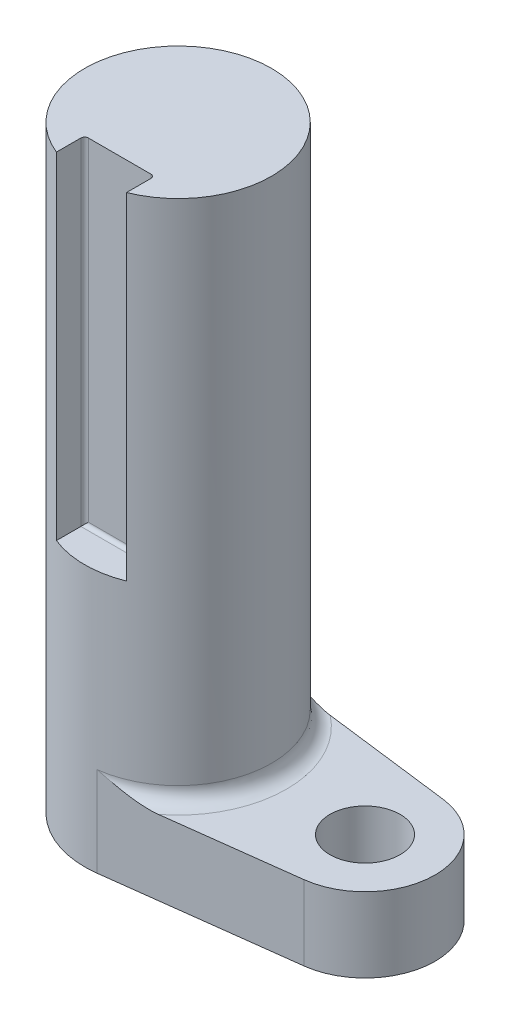
ISO-10303-21;
HEADER;
FILE_DESCRIPTION(('STEP AP214'),'2;1');
FILE_NAME('part.step','',(''),(''),'','','');
FILE_SCHEMA(('AUTOMOTIVE_DESIGN { 1 0 10303 214 1 1 1 1 }'));
ENDSEC;
DATA;
#1=APPLICATION_CONTEXT('core data for automotive mechanical design processes');
#2=APPLICATION_PROTOCOL_DEFINITION('international standard','automotive_design',2000,#1);
#3=PRODUCT_CONTEXT('',#1,'mechanical');
#4=PRODUCT('Part','Part','',(#3));
#5=PRODUCT_RELATED_PRODUCT_CATEGORY('part','',(#4));
#6=PRODUCT_DEFINITION_FORMATION('','',#4);
#7=PRODUCT_DEFINITION_CONTEXT('part definition',#1,'design');
#8=PRODUCT_DEFINITION('design','',#6,#7);
#9=PRODUCT_DEFINITION_SHAPE('','',#8);
#10=(LENGTH_UNIT() NAMED_UNIT(*) SI_UNIT(.MILLI.,.METRE.));
#11=(NAMED_UNIT(*) PLANE_ANGLE_UNIT() SI_UNIT($,.RADIAN.));
#12=(NAMED_UNIT(*) SI_UNIT($,.STERADIAN.) SOLID_ANGLE_UNIT());
#13=UNCERTAINTY_MEASURE_WITH_UNIT(LENGTH_MEASURE(1.E-05),#10,'distance_accuracy_value','');
#14=(GEOMETRIC_REPRESENTATION_CONTEXT(3) GLOBAL_UNCERTAINTY_ASSIGNED_CONTEXT((#13)) GLOBAL_UNIT_ASSIGNED_CONTEXT((#10,
#11,#12)) REPRESENTATION_CONTEXT('',''));
#15=CARTESIAN_POINT('',(0.,0.,0.));
#16=DIRECTION('',(0.,0.,1.));
#17=DIRECTION('',(1.,0.,0.));
#18=AXIS2_PLACEMENT_3D('',#15,#16,#17);
#19=CARTESIAN_POINT('',(0.,17.78,0.));
#20=DIRECTION('',(0.,-1.,0.));
#21=DIRECTION('',(0.,0.,-1.));
#22=AXIS2_PLACEMENT_3D('',#19,#20,#21);
#23=CYLINDRICAL_SURFACE('',#22,3.175);
#24=CARTESIAN_POINT('',(0.,0.508000000000002,0.));
#25=DIRECTION('',(0.,-1.,0.));
#26=DIRECTION('',(0.,0.,-1.));
#27=AXIS2_PLACEMENT_3D('',#24,#25,#26);
#28=CIRCLE('',#27,3.175);
#29=CARTESIAN_POINT('',(0.396875,0.508000000000002,3.15009765473628));
#30=VERTEX_POINT('',#29);
#31=CARTESIAN_POINT('',(0.396875,0.508000000000002,-3.15009765473628));
#32=VERTEX_POINT('',#31);
#33=EDGE_CURVE('E210',#30,#32,#28,.F.);
#34=ORIENTED_EDGE('',*,*,#33,.T.);
#35=DIRECTION('',(0.,1.,0.));
#36=VECTOR('',#35,1.);
#37=CARTESIAN_POINT('',(0.396875,-2.54,-3.15009765473628));
#38=LINE('',#37,#36);
#39=CARTESIAN_POINT('',(0.396875,-2.54,-3.15009765473628));
#40=VERTEX_POINT('',#39);
#41=EDGE_CURVE('E190',#40,#32,#38,.T.);
#42=ORIENTED_EDGE('',*,*,#41,.F.);
#43=CARTESIAN_POINT('',(0.,-2.54,0.));
#44=DIRECTION('',(0.,-1.,0.));
#45=DIRECTION('',(0.,0.,-1.));
#46=AXIS2_PLACEMENT_3D('',#43,#44,#45);
#47=CIRCLE('',#46,3.175);
#48=CARTESIAN_POINT('',(0.396875,-2.54,3.15009765473628));
#49=VERTEX_POINT('',#48);
#50=EDGE_CURVE('E188',#49,#40,#47,.T.);
#51=ORIENTED_EDGE('',*,*,#50,.F.);
#52=DIRECTION('',(0.,1.,0.));
#53=VECTOR('',#52,1.);
#54=CARTESIAN_POINT('',(0.396875,-2.54,3.15009765473628));
#55=LINE('',#54,#53);
#56=EDGE_CURVE('E201',#49,#30,#55,.T.);
#57=ORIENTED_EDGE('',*,*,#56,.T.);
#58=EDGE_LOOP('',(#34,#42,#51,#57));
#59=FACE_BOUND('',#58,.T.);
#60=DIRECTION('',(0.,-1.,0.));
#61=VECTOR('',#60,1.);
#62=CARTESIAN_POINT('',(1.190625,17.78,2.94330377456609));
#63=LINE('',#62,#61);
#64=CARTESIAN_POINT('',(1.190625,6.35,2.94330377456609));
#65=VERTEX_POINT('',#64);
#66=CARTESIAN_POINT('',(1.190625,17.78,2.94330377456609));
#67=VERTEX_POINT('',#66);
#68=EDGE_CURVE('E142',#65,#67,#63,.F.);
#69=ORIENTED_EDGE('',*,*,#68,.F.);
#70=CARTESIAN_POINT('',(0.,6.35,0.));
#71=DIRECTION('',(0.,-1.,0.));
#72=DIRECTION('',(0.,0.,-1.));
#73=AXIS2_PLACEMENT_3D('',#70,#71,#72);
#74=CIRCLE('',#73,3.175);
#75=CARTESIAN_POINT('',(-1.190625,6.35,2.94330377456609));
#76=VERTEX_POINT('',#75);
#77=EDGE_CURVE('E127',#65,#76,#74,.T.);
#78=ORIENTED_EDGE('',*,*,#77,.T.);
#79=DIRECTION('',(0.,-1.,0.));
#80=VECTOR('',#79,1.);
#81=CARTESIAN_POINT('',(-1.190625,17.78,2.94330377456609));
#82=LINE('',#81,#80);
#83=CARTESIAN_POINT('',(-1.190625,17.78,2.94330377456609));
#84=VERTEX_POINT('',#83);
#85=EDGE_CURVE('E132',#84,#76,#82,.T.);
#86=ORIENTED_EDGE('',*,*,#85,.F.);
#87=CARTESIAN_POINT('',(0.,17.78,0.));
#88=DIRECTION('',(0.,1.,0.));
#89=DIRECTION('',(0.,0.,1.));
#90=AXIS2_PLACEMENT_3D('',#87,#88,#89);
#91=CIRCLE('',#90,3.175);
#92=EDGE_CURVE('E208',#67,#84,#91,.T.);
#93=ORIENTED_EDGE('',*,*,#92,.F.);
#94=EDGE_LOOP('',(#69,#78,#86,#93));
#95=FACE_BOUND('',#94,.T.);
#96=ADVANCED_FACE('F39',(#59,#95),#23,.T.);
#97=CARTESIAN_POINT('',(0.,17.78,0.));
#98=DIRECTION('',(0.,1.,0.));
#99=DIRECTION('',(0.,0.,1.));
#100=AXIS2_PLACEMENT_3D('',#97,#98,#99);
#101=PLANE('',#100);
#102=DIRECTION('',(0.,0.,-1.));
#103=VECTOR('',#102,1.);
#104=CARTESIAN_POINT('',(-1.190625,17.78,0.));
#105=LINE('',#104,#103);
#106=CARTESIAN_POINT('',(-1.190625,17.78,2.11328));
#107=VERTEX_POINT('',#106);
#108=EDGE_CURVE('E138',#84,#107,#105,.T.);
#109=ORIENTED_EDGE('',*,*,#108,.T.);
#110=CARTESIAN_POINT('',(-1.063625,17.78,2.11328));
#111=DIRECTION('',(0.,1.,0.));
#112=DIRECTION('',(0.,0.,1.));
#113=AXIS2_PLACEMENT_3D('',#110,#111,#112);
#114=CIRCLE('',#113,0.127);
#115=CARTESIAN_POINT('',(-1.063625,17.78,1.98628));
#116=VERTEX_POINT('',#115);
#117=EDGE_CURVE('E48',#107,#116,#114,.F.);
#118=ORIENTED_EDGE('',*,*,#117,.T.);
#119=DIRECTION('',(1.,0.,0.));
#120=VECTOR('',#119,1.);
#121=CARTESIAN_POINT('',(0.,17.78,1.98628));
#122=LINE('',#121,#120);
#123=CARTESIAN_POINT('',(1.063625,17.78,1.98628));
#124=VERTEX_POINT('',#123);
#125=EDGE_CURVE('E151',#116,#124,#122,.T.);
#126=ORIENTED_EDGE('',*,*,#125,.T.);
#127=CARTESIAN_POINT('',(1.063625,17.78,2.11328));
#128=DIRECTION('',(0.,1.,0.));
#129=DIRECTION('',(0.,0.,1.));
#130=AXIS2_PLACEMENT_3D('',#127,#128,#129);
#131=CIRCLE('',#130,0.127);
#132=CARTESIAN_POINT('',(1.190625,17.78,2.11328));
#133=VERTEX_POINT('',#132);
#134=EDGE_CURVE('E11',#124,#133,#131,.F.);
#135=ORIENTED_EDGE('',*,*,#134,.T.);
#136=DIRECTION('',(0.,0.,1.));
#137=VECTOR('',#136,1.);
#138=CARTESIAN_POINT('',(1.190625,17.78,0.));
#139=LINE('',#138,#137);
#140=EDGE_CURVE('E147',#133,#67,#139,.T.);
#141=ORIENTED_EDGE('',*,*,#140,.T.);
#142=ORIENTED_EDGE('',*,*,#92,.T.);
#143=EDGE_LOOP('',(#109,#118,#126,#135,#141,#142));
#144=FACE_BOUND('',#143,.T.);
#145=ADVANCED_FACE('F251',(#144),#101,.T.);
#146=CARTESIAN_POINT('',(0.396875,-2.54,-3.15009765473628));
#147=DIRECTION('',(0.125,0.,-0.992156741649221));
#148=DIRECTION('',(-0.992156741649222,0.,-0.125));
#149=AXIS2_PLACEMENT_3D('',#146,#147,#148);
#150=PLANE('',#149);
#151=DIRECTION('',(-0.992156741649222,0.,-0.125));
#152=VECTOR('',#151,1.);
#153=CARTESIAN_POINT('',(0.396875,0.,-3.15009765473628));
#154=LINE('',#153,#152);
#155=CARTESIAN_POINT('',(6.64765625,0.,-2.36257324105221));
#156=VERTEX_POINT('',#155);
#157=CARTESIAN_POINT('',(2.24874665457004,0.,-2.91678375673618));
#158=VERTEX_POINT('',#157);
#159=EDGE_CURVE('E193',#156,#158,#154,.T.);
#160=ORIENTED_EDGE('',*,*,#159,.F.);
#161=DIRECTION('',(0.,1.,0.));
#162=VECTOR('',#161,1.);
#163=CARTESIAN_POINT('',(6.64765625,-2.54,-2.36257324105221));
#164=LINE('',#163,#162);
#165=CARTESIAN_POINT('',(6.64765625,-2.54,-2.36257324105221));
#166=VERTEX_POINT('',#165);
#167=EDGE_CURVE('E206',#166,#156,#164,.T.);
#168=ORIENTED_EDGE('',*,*,#167,.F.);
#169=DIRECTION('',(-0.992156741649222,0.,-0.125));
#170=VECTOR('',#169,1.);
#171=CARTESIAN_POINT('',(0.396875,-2.54,-3.15009765473628));
#172=LINE('',#171,#170);
#173=EDGE_CURVE('E178',#166,#40,#172,.T.);
#174=ORIENTED_EDGE('',*,*,#173,.T.);
#175=ORIENTED_EDGE('',*,*,#41,.T.);
#176=CARTESIAN_POINT('',(2.24874665457004,0.,-2.91678375673618));
#177=CARTESIAN_POINT('',(2.21231549692085,5.71728721592752E-06,-2.92137365117018));
#178=CARTESIAN_POINT('',(2.1758992098971,0.00102172884681024,-2.92596167208147));
#179=CARTESIAN_POINT('',(2.1031796100752,0.00485117368516612,-2.93512348048952));
#180=CARTESIAN_POINT('',(2.0668762431913,0.00766354336836887,-2.93969727480043));
#181=CARTESIAN_POINT('',(1.95839957562028,0.0184425634130274,-2.95336405029785));
#182=CARTESIAN_POINT('',(1.88645399557375,0.0287536847308181,-2.9624283413804));
#183=CARTESIAN_POINT('',(1.74411958427555,0.0541431163065831,-2.98036079163286));
#184=CARTESIAN_POINT('',(1.67372251439236,0.0691765666242501,-2.9892299887728));
#185=CARTESIAN_POINT('',(1.53378182393322,0.103023101549795,-3.00686085854677));
#186=CARTESIAN_POINT('',(1.46423892542614,0.121839177901396,-3.01562244020869));
#187=CARTESIAN_POINT('',(1.22704733837716,0.191369163494823,-3.04550577127576));
#188=CARTESIAN_POINT('',(1.06148442447234,0.249183267367272,-3.06636473777706));
#189=CARTESIAN_POINT('',(0.73302229538363,0.372566088486213,-3.10774707628523));
#190=CARTESIAN_POINT('',(0.570129927965523,0.438151996715627,-3.12826958555471));
#191=CARTESIAN_POINT('',(0.403795894832264,0.505209760541777,-3.14922570394694));
#192=CARTESIAN_POINT('',(0.400335450392073,0.506604880917865,-3.14966167896667));
#193=CARTESIAN_POINT('',(0.396875,0.508000000000002,-3.15009765473628));
#194=B_SPLINE_CURVE_WITH_KNOTS('',3,(#176,#177,#178,#179,#180,#181,#182,#183,#184,#185,#186,
#187,#188,#189,#190,#191,#192,#193),.UNSPECIFIED.,.F.,.F.,(4,2,2,2,2,2,2,2,4),(0.,
0.110120572144947,0.22017600398342,0.439667149666635,0.657133261980571,0.874772053488899,
1.40399836213705,1.93441795718018,1.94568738488306),.UNSPECIFIED.);
#195=EDGE_CURVE('E215',#32,#158,#194,.F.);
#196=ORIENTED_EDGE('',*,*,#195,.T.);
#197=EDGE_LOOP('',(#160,#168,#174,#175,#196));
#198=FACE_BOUND('',#197,.T.);
#199=ADVANCED_FACE('F228',(#198),#150,.T.);
#200=CARTESIAN_POINT('',(6.35,-2.54,0.));
#201=DIRECTION('',(0.,1.,0.));
#202=DIRECTION('',(0.,0.,1.));
#203=AXIS2_PLACEMENT_3D('',#200,#201,#202);
#204=CYLINDRICAL_SURFACE('',#203,2.38125);
#205=CARTESIAN_POINT('',(6.35,0.,0.));
#206=DIRECTION('',(0.,-1.,0.));
#207=DIRECTION('',(0.,0.,-1.));
#208=AXIS2_PLACEMENT_3D('',#205,#206,#207);
#209=CIRCLE('',#208,2.38125);
#210=CARTESIAN_POINT('',(6.64765625,0.,2.36257324105221));
#211=VERTEX_POINT('',#210);
#212=EDGE_CURVE('E196',#211,#156,#209,.F.);
#213=ORIENTED_EDGE('',*,*,#212,.F.);
#214=DIRECTION('',(0.,1.,0.));
#215=VECTOR('',#214,1.);
#216=CARTESIAN_POINT('',(6.64765625,-2.54,2.36257324105221));
#217=LINE('',#216,#215);
#218=CARTESIAN_POINT('',(6.64765625,-2.54,2.36257324105221));
#219=VERTEX_POINT('',#218);
#220=EDGE_CURVE('E203',#219,#211,#217,.T.);
#221=ORIENTED_EDGE('',*,*,#220,.F.);
#222=CARTESIAN_POINT('',(6.35,-2.54,0.));
#223=DIRECTION('',(0.,-1.,0.));
#224=DIRECTION('',(0.,0.,-1.));
#225=AXIS2_PLACEMENT_3D('',#222,#223,#224);
#226=CIRCLE('',#225,2.38125);
#227=EDGE_CURVE('E182',#219,#166,#226,.F.);
#228=ORIENTED_EDGE('',*,*,#227,.T.);
#229=ORIENTED_EDGE('',*,*,#167,.T.);
#230=EDGE_LOOP('',(#213,#221,#228,#229));
#231=FACE_BOUND('',#230,.T.);
#232=ADVANCED_FACE('F270',(#231),#204,.T.);
#233=CARTESIAN_POINT('',(0.396875,-2.54,3.15009765473628));
#234=DIRECTION('',(0.125,0.,0.992156741649221));
#235=DIRECTION('',(0.992156741649222,0.,-0.125));
#236=AXIS2_PLACEMENT_3D('',#233,#234,#235);
#237=PLANE('',#236);
#238=DIRECTION('',(0.992156741649222,0.,-0.125));
#239=VECTOR('',#238,1.);
#240=CARTESIAN_POINT('',(0.396875,0.,3.15009765473628));
#241=LINE('',#240,#239);
#242=CARTESIAN_POINT('',(2.24874665457004,0.,2.91678375673618));
#243=VERTEX_POINT('',#242);
#244=EDGE_CURVE('E179',#243,#211,#241,.T.);
#245=ORIENTED_EDGE('',*,*,#244,.F.);
#246=CARTESIAN_POINT('',(2.24874665457004,0.,2.91678375673618));
#247=CARTESIAN_POINT('',(2.21231549692086,5.71728721580148E-06,2.92137365117018));
#248=CARTESIAN_POINT('',(2.17589920989712,0.00102172884680957,2.92596167208147));
#249=CARTESIAN_POINT('',(2.10317961007524,0.00485117368516336,2.93512348048951));
#250=CARTESIAN_POINT('',(2.06687624319136,0.00766354336836454,2.93969727480042));
#251=CARTESIAN_POINT('',(1.95839957562036,0.0184425634130171,2.95336405029784));
#252=CARTESIAN_POINT('',(1.88645399557386,0.028753684730802,2.96242834138038));
#253=CARTESIAN_POINT('',(1.74411958427564,0.0541431163065639,2.98036079163285));
#254=CARTESIAN_POINT('',(1.67372251439244,0.0691765666242362,2.98922998877279));
#255=CARTESIAN_POINT('',(1.53378182393325,0.103023101549782,3.00686085854677));
#256=CARTESIAN_POINT('',(1.46423892542615,0.121839177901378,3.01562244020869));
#257=CARTESIAN_POINT('',(1.22704733837717,0.191369163494857,3.04550577127576));
#258=CARTESIAN_POINT('',(1.0614844244724,0.249183267367469,3.06636473777705));
#259=CARTESIAN_POINT('',(0.733022295383541,0.372566088486026,3.10774707628524));
#260=CARTESIAN_POINT('',(0.570129927965227,0.438151996714891,3.12826958555474));
#261=CARTESIAN_POINT('',(0.403795894832254,0.505209760541744,3.14922570394694));
#262=CARTESIAN_POINT('',(0.400335450392068,0.506604880917849,3.14966167896667));
#263=CARTESIAN_POINT('',(0.396875,0.508000000000002,3.15009765473628));
#264=B_SPLINE_CURVE_WITH_KNOTS('',3,(#246,#247,#248,#249,#250,#251,#252,#253,#254,#255,#256,
#257,#258,#259,#260,#261,#262,#263),.UNSPECIFIED.,.F.,.F.,(4,2,2,2,2,2,2,2,4),(0.,
0.110120572144913,0.220176003983352,0.439667149666513,0.657133261980515,0.874772053488902,
1.40399836213707,1.93441795718017,1.94568738488306),.UNSPECIFIED.);
#265=EDGE_CURVE('E222',#243,#30,#264,.T.);
#266=ORIENTED_EDGE('',*,*,#265,.T.);
#267=ORIENTED_EDGE('',*,*,#56,.F.);
#268=DIRECTION('',(0.992156741649222,0.,-0.125));
#269=VECTOR('',#268,1.);
#270=CARTESIAN_POINT('',(0.396875,-2.54,3.15009765473628));
#271=LINE('',#270,#269);
#272=EDGE_CURVE('E185',#49,#219,#271,.T.);
#273=ORIENTED_EDGE('',*,*,#272,.T.);
#274=ORIENTED_EDGE('',*,*,#220,.T.);
#275=EDGE_LOOP('',(#245,#266,#267,#273,#274));
#276=FACE_BOUND('',#275,.T.);
#277=ADVANCED_FACE('F277',(#276),#237,.T.);
#278=CARTESIAN_POINT('',(6.35,-2.54,0.));
#279=DIRECTION('',(0.,1.,0.));
#280=DIRECTION('',(0.,0.,1.));
#281=AXIS2_PLACEMENT_3D('',#278,#279,#280);
#282=CYLINDRICAL_SURFACE('',#281,1.190625);
#283=CARTESIAN_POINT('',(6.35,-2.54,0.));
#284=DIRECTION('',(0.,-1.,0.));
#285=DIRECTION('',(0.,0.,-1.));
#286=AXIS2_PLACEMENT_3D('',#283,#284,#285);
#287=CIRCLE('',#286,1.190625);
#288=CARTESIAN_POINT('',(6.35,-2.54,-1.190625));
#289=VERTEX_POINT('',#288);
#290=EDGE_CURVE('E175',#289,#289,#287,.T.);
#291=ORIENTED_EDGE('',*,*,#290,.T.);
#292=EDGE_LOOP('',(#291));
#293=FACE_BOUND('',#292,.T.);
#294=CARTESIAN_POINT('',(6.35,0.,0.));
#295=DIRECTION('',(0.,-1.,0.));
#296=DIRECTION('',(0.,0.,-1.));
#297=AXIS2_PLACEMENT_3D('',#294,#295,#296);
#298=CIRCLE('',#297,1.190625);
#299=CARTESIAN_POINT('',(6.35,0.,-1.190625));
#300=VERTEX_POINT('',#299);
#301=EDGE_CURVE('E174',#300,#300,#298,.T.);
#302=ORIENTED_EDGE('',*,*,#301,.F.);
#303=EDGE_LOOP('',(#302));
#304=FACE_BOUND('',#303,.T.);
#305=ADVANCED_FACE('F295',(#293,#304),#282,.F.);
#306=CARTESIAN_POINT('',(0.,-2.54,0.));
#307=DIRECTION('',(0.,-1.,0.));
#308=DIRECTION('',(0.,0.,-1.));
#309=AXIS2_PLACEMENT_3D('',#306,#307,#308);
#310=PLANE('',#309);
#311=ORIENTED_EDGE('',*,*,#290,.F.);
#312=EDGE_LOOP('',(#311));
#313=FACE_BOUND('',#312,.T.);
#314=ORIENTED_EDGE('',*,*,#173,.F.);
#315=ORIENTED_EDGE('',*,*,#227,.F.);
#316=ORIENTED_EDGE('',*,*,#272,.F.);
#317=ORIENTED_EDGE('',*,*,#50,.T.);
#318=EDGE_LOOP('',(#314,#315,#316,#317));
#319=FACE_BOUND('',#318,.T.);
#320=ADVANCED_FACE('F274',(#313,#319),#310,.T.);
#321=CARTESIAN_POINT('',(0.,0.,0.));
#322=DIRECTION('',(0.,-1.,0.));
#323=DIRECTION('',(0.,0.,-1.));
#324=AXIS2_PLACEMENT_3D('',#321,#322,#323);
#325=PLANE('',#324);
#326=ORIENTED_EDGE('',*,*,#159,.T.);
#327=CARTESIAN_POINT('',(0.,0.,0.));
#328=DIRECTION('',(0.,-1.,0.));
#329=DIRECTION('',(0.,0.,-1.));
#330=AXIS2_PLACEMENT_3D('',#327,#328,#329);
#331=CIRCLE('',#330,3.683);
#332=EDGE_CURVE('E213',#158,#243,#331,.T.);
#333=ORIENTED_EDGE('',*,*,#332,.T.);
#334=ORIENTED_EDGE('',*,*,#244,.T.);
#335=ORIENTED_EDGE('',*,*,#212,.T.);
#336=EDGE_LOOP('',(#326,#333,#334,#335));
#337=FACE_BOUND('',#336,.T.);
#338=ORIENTED_EDGE('',*,*,#301,.T.);
#339=EDGE_LOOP('',(#338));
#340=FACE_BOUND('',#339,.T.);
#341=ADVANCED_FACE('F237',(#337,#340),#325,.F.);
#342=CARTESIAN_POINT('',(0.,0.508000000000002,0.));
#343=DIRECTION('',(0.,-1.,0.));
#344=DIRECTION('',(0.,0.,-1.));
#345=AXIS2_PLACEMENT_3D('',#342,#343,#344);
#346=TOROIDAL_SURFACE('',#345,3.683,0.508);
#347=ORIENTED_EDGE('',*,*,#265,.F.);
#348=ORIENTED_EDGE('',*,*,#332,.F.);
#349=ORIENTED_EDGE('',*,*,#195,.F.);
#350=ORIENTED_EDGE('',*,*,#33,.F.);
#351=EDGE_LOOP('',(#347,#348,#349,#350));
#352=FACE_BOUND('',#351,.T.);
#353=ADVANCED_FACE('F232',(#352),#346,.F.);
#354=CARTESIAN_POINT('',(0.,6.35,0.));
#355=DIRECTION('',(0.,-1.,0.));
#356=DIRECTION('',(0.,0.,-1.));
#357=AXIS2_PLACEMENT_3D('',#354,#355,#356);
#358=PLANE('',#357);
#359=DIRECTION('',(0.,0.,-1.));
#360=VECTOR('',#359,1.);
#361=CARTESIAN_POINT('',(1.190625,6.35,4.36372));
#362=LINE('',#361,#360);
#363=CARTESIAN_POINT('',(1.190625,6.35,2.11328));
#364=VERTEX_POINT('',#363);
#365=EDGE_CURVE('E133',#65,#364,#362,.T.);
#366=ORIENTED_EDGE('',*,*,#365,.T.);
#367=DIRECTION('',(-1.,0.,0.));
#368=VECTOR('',#367,1.);
#369=CARTESIAN_POINT('',(0.,6.35,2.11328));
#370=LINE('',#369,#368);
#371=CARTESIAN_POINT('',(-1.190625,6.35,2.11328));
#372=VERTEX_POINT('',#371);
#373=EDGE_CURVE('E129',#364,#372,#370,.T.);
#374=ORIENTED_EDGE('',*,*,#373,.T.);
#375=DIRECTION('',(0.,0.,1.));
#376=VECTOR('',#375,1.);
#377=CARTESIAN_POINT('',(-1.190625,6.35,4.36372));
#378=LINE('',#377,#376);
#379=EDGE_CURVE('E123',#372,#76,#378,.T.);
#380=ORIENTED_EDGE('',*,*,#379,.T.);
#381=ORIENTED_EDGE('',*,*,#77,.F.);
#382=EDGE_LOOP('',(#366,#374,#380,#381));
#383=FACE_BOUND('',#382,.T.);
#384=ADVANCED_FACE('F125',(#383),#358,.F.);
#385=CARTESIAN_POINT('',(1.190625,19.05,4.36372));
#386=DIRECTION('',(-1.,0.,0.));
#387=DIRECTION('',(0.,0.,1.));
#388=AXIS2_PLACEMENT_3D('',#385,#386,#387);
#389=PLANE('',#388);
#390=ORIENTED_EDGE('',*,*,#140,.F.);
#391=DIRECTION('',(0.,-1.,0.));
#392=VECTOR('',#391,1.);
#393=CARTESIAN_POINT('',(1.190625,6.35,2.11328));
#394=LINE('',#393,#392);
#395=EDGE_CURVE('E56',#133,#364,#394,.T.);
#396=ORIENTED_EDGE('',*,*,#395,.T.);
#397=ORIENTED_EDGE('',*,*,#365,.F.);
#398=ORIENTED_EDGE('',*,*,#68,.T.);
#399=EDGE_LOOP('',(#390,#396,#397,#398));
#400=FACE_BOUND('',#399,.T.);
#401=ADVANCED_FACE('F287',(#400),#389,.T.);
#402=CARTESIAN_POINT('',(-1.190625,19.05,4.36372));
#403=DIRECTION('',(1.,0.,0.));
#404=DIRECTION('',(0.,0.,-1.));
#405=AXIS2_PLACEMENT_3D('',#402,#403,#404);
#406=PLANE('',#405);
#407=ORIENTED_EDGE('',*,*,#379,.F.);
#408=DIRECTION('',(0.,-1.,0.));
#409=VECTOR('',#408,1.);
#410=CARTESIAN_POINT('',(-1.190625,17.78,2.11328));
#411=LINE('',#410,#409);
#412=EDGE_CURVE('E159',#372,#107,#411,.F.);
#413=ORIENTED_EDGE('',*,*,#412,.T.);
#414=ORIENTED_EDGE('',*,*,#108,.F.);
#415=ORIENTED_EDGE('',*,*,#85,.T.);
#416=EDGE_LOOP('',(#407,#413,#414,#415));
#417=FACE_BOUND('',#416,.T.);
#418=ADVANCED_FACE('F136',(#417),#406,.T.);
#419=CARTESIAN_POINT('',(-1.190625,19.05,1.98628));
#420=DIRECTION('',(0.,0.,1.));
#421=DIRECTION('',(1.,0.,0.));
#422=AXIS2_PLACEMENT_3D('',#419,#420,#421);
#423=PLANE('',#422);
#424=ORIENTED_EDGE('',*,*,#125,.F.);
#425=DIRECTION('',(0.,-1.,0.));
#426=VECTOR('',#425,1.);
#427=CARTESIAN_POINT('',(-1.063625,6.35,1.98628));
#428=LINE('',#427,#426);
#429=CARTESIAN_POINT('',(-1.063625,6.477,1.98628));
#430=VERTEX_POINT('',#429);
#431=EDGE_CURVE('E156',#116,#430,#428,.T.);
#432=ORIENTED_EDGE('',*,*,#431,.T.);
#433=DIRECTION('',(-1.,0.,0.));
#434=VECTOR('',#433,1.);
#435=CARTESIAN_POINT('',(-1.190625,6.477,1.98628));
#436=LINE('',#435,#434);
#437=CARTESIAN_POINT('',(1.063625,6.477,1.98628));
#438=VERTEX_POINT('',#437);
#439=EDGE_CURVE('E146',#430,#438,#436,.F.);
#440=ORIENTED_EDGE('',*,*,#439,.T.);
#441=DIRECTION('',(0.,-1.,0.));
#442=VECTOR('',#441,1.);
#443=CARTESIAN_POINT('',(1.063625,17.78,1.98628));
#444=LINE('',#443,#442);
#445=EDGE_CURVE('E149',#438,#124,#444,.F.);
#446=ORIENTED_EDGE('',*,*,#445,.T.);
#447=EDGE_LOOP('',(#424,#432,#440,#446));
#448=FACE_BOUND('',#447,.T.);
#449=ADVANCED_FACE('F248',(#448),#423,.T.);
#450=CARTESIAN_POINT('',(1.063625,19.05,2.11328));
#451=DIRECTION('',(0.,1.,0.));
#452=DIRECTION('',(0.,0.,1.));
#453=AXIS2_PLACEMENT_3D('',#450,#451,#452);
#454=CYLINDRICAL_SURFACE('',#453,0.127);
#455=ORIENTED_EDGE('',*,*,#134,.F.);
#456=ORIENTED_EDGE('',*,*,#445,.F.);
#457=CARTESIAN_POINT('',(1.063625,6.477,2.11328));
#458=DIRECTION('',(0.707106781186547,0.707106781186547,0.));
#459=DIRECTION('',(-0.707106781186547,0.707106781186547,0.));
#460=AXIS2_PLACEMENT_3D('',#457,#458,#459);
#461=ELLIPSE('',#460,0.179605122421383,0.127);
#462=EDGE_CURVE('E43',#364,#438,#461,.T.);
#463=ORIENTED_EDGE('',*,*,#462,.F.);
#464=ORIENTED_EDGE('',*,*,#395,.F.);
#465=EDGE_LOOP('',(#455,#456,#463,#464));
#466=FACE_BOUND('',#465,.T.);
#467=ADVANCED_FACE('F41',(#466),#454,.F.);
#468=CARTESIAN_POINT('',(0.,6.477,2.11328));
#469=DIRECTION('',(-1.,0.,0.));
#470=DIRECTION('',(0.,0.,1.));
#471=AXIS2_PLACEMENT_3D('',#468,#469,#470);
#472=CYLINDRICAL_SURFACE('',#471,0.127);
#473=ORIENTED_EDGE('',*,*,#462,.T.);
#474=ORIENTED_EDGE('',*,*,#439,.F.);
#475=CARTESIAN_POINT('',(-1.063625,6.477,2.11328));
#476=DIRECTION('',(-0.707106781186547,0.707106781186547,0.));
#477=DIRECTION('',(0.707106781186547,0.707106781186547,0.));
#478=AXIS2_PLACEMENT_3D('',#475,#476,#477);
#479=ELLIPSE('',#478,0.179605122421383,0.127);
#480=EDGE_CURVE('E163',#372,#430,#479,.F.);
#481=ORIENTED_EDGE('',*,*,#480,.F.);
#482=ORIENTED_EDGE('',*,*,#373,.F.);
#483=EDGE_LOOP('',(#473,#474,#481,#482));
#484=FACE_BOUND('',#483,.T.);
#485=ADVANCED_FACE('F243',(#484),#472,.F.);
#486=CARTESIAN_POINT('',(-1.063625,19.05,2.11328));
#487=DIRECTION('',(0.,1.,0.));
#488=DIRECTION('',(0.,0.,1.));
#489=AXIS2_PLACEMENT_3D('',#486,#487,#488);
#490=CYLINDRICAL_SURFACE('',#489,0.127);
#491=ORIENTED_EDGE('',*,*,#117,.F.);
#492=ORIENTED_EDGE('',*,*,#412,.F.);
#493=ORIENTED_EDGE('',*,*,#480,.T.);
#494=ORIENTED_EDGE('',*,*,#431,.F.);
#495=EDGE_LOOP('',(#491,#492,#493,#494));
#496=FACE_BOUND('',#495,.T.);
#497=ADVANCED_FACE('F240',(#496),#490,.F.);
#498=CLOSED_SHELL('',(#96,#145,#199,#232,#277,#305,#320,#341,#353,#384,#401,#418,#449,#467,#485,#497));
#499=MANIFOLD_SOLID_BREP('B2',#498);
#500=ADVANCED_BREP_SHAPE_REPRESENTATION('',(#18,#499),#14);
#501=SHAPE_DEFINITION_REPRESENTATION(#9,#500);
ENDSEC;
END-ISO-10303-21;
